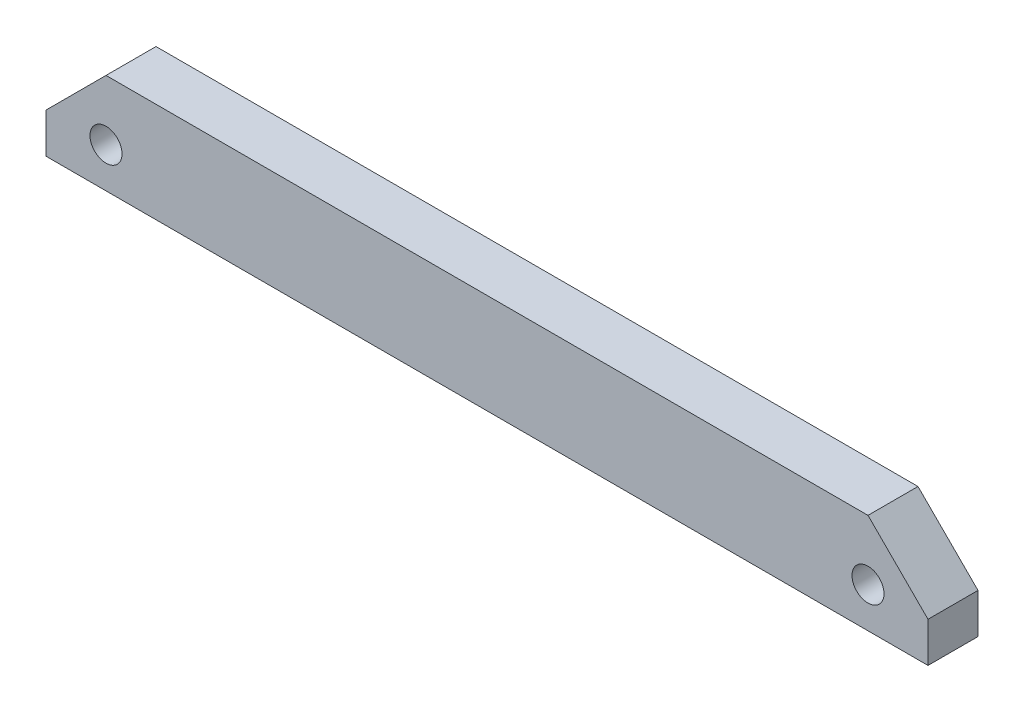
ISO-10303-21;
HEADER;
FILE_DESCRIPTION(('STEP AP214'),'2;1');
FILE_NAME('part.step','',(''),(''),'','','');
FILE_SCHEMA(('AUTOMOTIVE_DESIGN { 1 0 10303 214 1 1 1 1 }'));
ENDSEC;
DATA;
#1=APPLICATION_CONTEXT('core data for automotive mechanical design processes');
#2=APPLICATION_PROTOCOL_DEFINITION('international standard','automotive_design',2000,#1);
#3=PRODUCT_CONTEXT('',#1,'mechanical');
#4=PRODUCT('Part','Part','',(#3));
#5=PRODUCT_RELATED_PRODUCT_CATEGORY('part','',(#4));
#6=PRODUCT_DEFINITION_FORMATION('','',#4);
#7=PRODUCT_DEFINITION_CONTEXT('part definition',#1,'design');
#8=PRODUCT_DEFINITION('design','',#6,#7);
#9=PRODUCT_DEFINITION_SHAPE('','',#8);
#10=(LENGTH_UNIT() NAMED_UNIT(*) SI_UNIT(.MILLI.,.METRE.));
#11=(NAMED_UNIT(*) PLANE_ANGLE_UNIT() SI_UNIT($,.RADIAN.));
#12=(NAMED_UNIT(*) SI_UNIT($,.STERADIAN.) SOLID_ANGLE_UNIT());
#13=UNCERTAINTY_MEASURE_WITH_UNIT(LENGTH_MEASURE(1.E-05),#10,'distance_accuracy_value','');
#14=(GEOMETRIC_REPRESENTATION_CONTEXT(3) GLOBAL_UNCERTAINTY_ASSIGNED_CONTEXT((#13)) GLOBAL_UNIT_ASSIGNED_CONTEXT((#10,
#11,#12)) REPRESENTATION_CONTEXT('',''));
#15=CARTESIAN_POINT('',(0.,0.,0.));
#16=DIRECTION('',(0.,0.,1.));
#17=DIRECTION('',(1.,0.,0.));
#18=AXIS2_PLACEMENT_3D('',#15,#16,#17);
#19=CARTESIAN_POINT('',(44.1,0.,5.));
#20=DIRECTION('',(-1.,0.,0.));
#21=DIRECTION('',(0.,0.,1.));
#22=AXIS2_PLACEMENT_3D('',#19,#20,#21);
#23=PLANE('',#22);
#24=DIRECTION('',(0.,1.,0.));
#25=VECTOR('',#24,1.);
#26=CARTESIAN_POINT('',(44.1,0.,0.));
#27=LINE('',#26,#25);
#28=CARTESIAN_POINT('',(44.1,0.,0.));
#29=VERTEX_POINT('',#28);
#30=CARTESIAN_POINT('',(44.1,4.00000000000002,0.));
#31=VERTEX_POINT('',#30);
#32=EDGE_CURVE('E128',#29,#31,#27,.T.);
#33=ORIENTED_EDGE('',*,*,#32,.T.);
#34=DIRECTION('',(0.,0.,-1.));
#35=VECTOR('',#34,1.);
#36=CARTESIAN_POINT('',(44.1,4.00000000000002,5.));
#37=LINE('',#36,#35);
#38=CARTESIAN_POINT('',(44.1,4.00000000000002,5.));
#39=VERTEX_POINT('',#38);
#40=EDGE_CURVE('E11',#39,#31,#37,.T.);
#41=ORIENTED_EDGE('',*,*,#40,.F.);
#42=DIRECTION('',(0.,1.,0.));
#43=VECTOR('',#42,1.);
#44=CARTESIAN_POINT('',(44.1,0.,5.));
#45=LINE('',#44,#43);
#46=CARTESIAN_POINT('',(44.1,0.,5.));
#47=VERTEX_POINT('',#46);
#48=EDGE_CURVE('E145',#47,#39,#45,.T.);
#49=ORIENTED_EDGE('',*,*,#48,.F.);
#50=DIRECTION('',(0.,0.,-1.));
#51=VECTOR('',#50,1.);
#52=CARTESIAN_POINT('',(44.1,0.,5.));
#53=LINE('',#52,#51);
#54=EDGE_CURVE('E124',#47,#29,#53,.T.);
#55=ORIENTED_EDGE('',*,*,#54,.T.);
#56=EDGE_LOOP('',(#33,#41,#49,#55));
#57=FACE_BOUND('',#56,.T.);
#58=ADVANCED_FACE('F39',(#57),#23,.F.);
#59=CARTESIAN_POINT('',(44.1,4.00000000000002,5.));
#60=DIRECTION('',(-0.707106781186544,-0.707106781186551,0.));
#61=DIRECTION('',(0.707106781186551,-0.707106781186544,0.));
#62=AXIS2_PLACEMENT_3D('',#59,#60,#61);
#63=PLANE('',#62);
#64=DIRECTION('',(-0.707106781186551,0.707106781186544,0.));
#65=VECTOR('',#64,1.);
#66=CARTESIAN_POINT('',(44.1,4.00000000000002,0.));
#67=LINE('',#66,#65);
#68=CARTESIAN_POINT('',(38.1,10.,0.));
#69=VERTEX_POINT('',#68);
#70=EDGE_CURVE('E132',#31,#69,#67,.T.);
#71=ORIENTED_EDGE('',*,*,#70,.T.);
#72=DIRECTION('',(0.,0.,-1.));
#73=VECTOR('',#72,1.);
#74=CARTESIAN_POINT('',(38.1,10.,5.));
#75=LINE('',#74,#73);
#76=CARTESIAN_POINT('',(38.1,10.,5.));
#77=VERTEX_POINT('',#76);
#78=EDGE_CURVE('E48',#77,#69,#75,.T.);
#79=ORIENTED_EDGE('',*,*,#78,.F.);
#80=DIRECTION('',(-0.707106781186551,0.707106781186544,0.));
#81=VECTOR('',#80,1.);
#82=CARTESIAN_POINT('',(44.1,4.00000000000002,5.));
#83=LINE('',#82,#81);
#84=EDGE_CURVE('E93',#39,#77,#83,.T.);
#85=ORIENTED_EDGE('',*,*,#84,.F.);
#86=ORIENTED_EDGE('',*,*,#40,.T.);
#87=EDGE_LOOP('',(#71,#79,#85,#86));
#88=FACE_BOUND('',#87,.T.);
#89=ADVANCED_FACE('F174',(#88),#63,.F.);
#90=CARTESIAN_POINT('',(38.1,10.,5.));
#91=DIRECTION('',(0.,-1.,0.));
#92=DIRECTION('',(1.,0.,0.));
#93=AXIS2_PLACEMENT_3D('',#90,#91,#92);
#94=PLANE('',#93);
#95=DIRECTION('',(-1.,0.,0.));
#96=VECTOR('',#95,1.);
#97=CARTESIAN_POINT('',(38.1,10.,0.));
#98=LINE('',#97,#96);
#99=CARTESIAN_POINT('',(-38.1000000000001,9.99999999999999,0.));
#100=VERTEX_POINT('',#99);
#101=EDGE_CURVE('E136',#69,#100,#98,.T.);
#102=ORIENTED_EDGE('',*,*,#101,.T.);
#103=DIRECTION('',(0.,0.,-1.));
#104=VECTOR('',#103,1.);
#105=CARTESIAN_POINT('',(-38.1000000000001,9.99999999999999,5.));
#106=LINE('',#105,#104);
#107=CARTESIAN_POINT('',(-38.1000000000001,9.99999999999999,5.));
#108=VERTEX_POINT('',#107);
#109=EDGE_CURVE('E117',#108,#100,#106,.T.);
#110=ORIENTED_EDGE('',*,*,#109,.F.);
#111=DIRECTION('',(-1.,0.,0.));
#112=VECTOR('',#111,1.);
#113=CARTESIAN_POINT('',(38.1,10.,5.));
#114=LINE('',#113,#112);
#115=EDGE_CURVE('E106',#77,#108,#114,.T.);
#116=ORIENTED_EDGE('',*,*,#115,.F.);
#117=ORIENTED_EDGE('',*,*,#78,.T.);
#118=EDGE_LOOP('',(#102,#110,#116,#117));
#119=FACE_BOUND('',#118,.T.);
#120=ADVANCED_FACE('F155',(#119),#94,.F.);
#121=CARTESIAN_POINT('',(-44.1,4.,5.));
#122=DIRECTION('',(0.707106781186552,-0.707106781186543,0.));
#123=DIRECTION('',(0.707106781186543,0.707106781186552,0.));
#124=AXIS2_PLACEMENT_3D('',#121,#122,#123);
#125=PLANE('',#124);
#126=DIRECTION('',(-0.707106781186543,-0.707106781186552,0.));
#127=VECTOR('',#126,1.);
#128=CARTESIAN_POINT('',(-44.1,4.,0.));
#129=LINE('',#128,#127);
#130=CARTESIAN_POINT('',(-44.1,4.,0.));
#131=VERTEX_POINT('',#130);
#132=EDGE_CURVE('E115',#100,#131,#129,.T.);
#133=ORIENTED_EDGE('',*,*,#132,.T.);
#134=DIRECTION('',(0.,0.,-1.));
#135=VECTOR('',#134,1.);
#136=CARTESIAN_POINT('',(-44.1,4.,5.));
#137=LINE('',#136,#135);
#138=CARTESIAN_POINT('',(-44.1,4.,5.));
#139=VERTEX_POINT('',#138);
#140=EDGE_CURVE('E112',#139,#131,#137,.T.);
#141=ORIENTED_EDGE('',*,*,#140,.F.);
#142=DIRECTION('',(-0.707106781186543,-0.707106781186552,0.));
#143=VECTOR('',#142,1.);
#144=CARTESIAN_POINT('',(-44.1,4.,5.));
#145=LINE('',#144,#143);
#146=EDGE_CURVE('E100',#108,#139,#145,.T.);
#147=ORIENTED_EDGE('',*,*,#146,.F.);
#148=ORIENTED_EDGE('',*,*,#109,.T.);
#149=EDGE_LOOP('',(#133,#141,#147,#148));
#150=FACE_BOUND('',#149,.T.);
#151=ADVANCED_FACE('F113',(#150),#125,.F.);
#152=CARTESIAN_POINT('',(-44.1,0.,5.));
#153=DIRECTION('',(1.,0.,0.));
#154=DIRECTION('',(0.,0.,-1.));
#155=AXIS2_PLACEMENT_3D('',#152,#153,#154);
#156=PLANE('',#155);
#157=DIRECTION('',(0.,-1.,0.));
#158=VECTOR('',#157,1.);
#159=CARTESIAN_POINT('',(-44.1,0.,0.));
#160=LINE('',#159,#158);
#161=CARTESIAN_POINT('',(-44.1,0.,0.));
#162=VERTEX_POINT('',#161);
#163=EDGE_CURVE('E79',#131,#162,#160,.T.);
#164=ORIENTED_EDGE('',*,*,#163,.T.);
#165=DIRECTION('',(0.,0.,-1.));
#166=VECTOR('',#165,1.);
#167=CARTESIAN_POINT('',(-44.1,0.,5.));
#168=LINE('',#167,#166);
#169=CARTESIAN_POINT('',(-44.1,0.,5.));
#170=VERTEX_POINT('',#169);
#171=EDGE_CURVE('E118',#170,#162,#168,.T.);
#172=ORIENTED_EDGE('',*,*,#171,.F.);
#173=DIRECTION('',(0.,-1.,0.));
#174=VECTOR('',#173,1.);
#175=CARTESIAN_POINT('',(-44.1,0.,5.));
#176=LINE('',#175,#174);
#177=EDGE_CURVE('E104',#139,#170,#176,.T.);
#178=ORIENTED_EDGE('',*,*,#177,.F.);
#179=ORIENTED_EDGE('',*,*,#140,.T.);
#180=EDGE_LOOP('',(#164,#172,#178,#179));
#181=FACE_BOUND('',#180,.T.);
#182=ADVANCED_FACE('F120',(#181),#156,.F.);
#183=CARTESIAN_POINT('',(-44.1,0.,5.));
#184=DIRECTION('',(0.,1.,0.));
#185=DIRECTION('',(-1.,0.,0.));
#186=AXIS2_PLACEMENT_3D('',#183,#184,#185);
#187=PLANE('',#186);
#188=DIRECTION('',(1.,0.,0.));
#189=VECTOR('',#188,1.);
#190=CARTESIAN_POINT('',(-44.1,0.,0.));
#191=LINE('',#190,#189);
#192=EDGE_CURVE('E85',#162,#29,#191,.T.);
#193=ORIENTED_EDGE('',*,*,#192,.T.);
#194=ORIENTED_EDGE('',*,*,#54,.F.);
#195=DIRECTION('',(1.,0.,0.));
#196=VECTOR('',#195,1.);
#197=CARTESIAN_POINT('',(-44.1,0.,5.));
#198=LINE('',#197,#196);
#199=EDGE_CURVE('E56',#170,#47,#198,.T.);
#200=ORIENTED_EDGE('',*,*,#199,.F.);
#201=ORIENTED_EDGE('',*,*,#171,.T.);
#202=EDGE_LOOP('',(#193,#194,#200,#201));
#203=FACE_BOUND('',#202,.T.);
#204=ADVANCED_FACE('F162',(#203),#187,.F.);
#205=CARTESIAN_POINT('',(0.,0.,5.));
#206=DIRECTION('',(0.,0.,1.));
#207=DIRECTION('',(1.,0.,0.));
#208=AXIS2_PLACEMENT_3D('',#205,#206,#207);
#209=PLANE('',#208);
#210=CARTESIAN_POINT('',(-38.1,4.,5.));
#211=DIRECTION('',(0.,0.,1.));
#212=DIRECTION('',(1.,0.,0.));
#213=AXIS2_PLACEMENT_3D('',#210,#211,#212);
#214=CIRCLE('',#213,1.60000000000001);
#215=CARTESIAN_POINT('',(-36.5,4.,5.));
#216=VERTEX_POINT('',#215);
#217=EDGE_CURVE('E239',#216,#216,#214,.T.);
#218=ORIENTED_EDGE('',*,*,#217,.F.);
#219=EDGE_LOOP('',(#218));
#220=FACE_BOUND('',#219,.T.);
#221=CARTESIAN_POINT('',(38.1,4.,5.));
#222=DIRECTION('',(0.,0.,1.));
#223=DIRECTION('',(-1.,0.,0.));
#224=AXIS2_PLACEMENT_3D('',#221,#222,#223);
#225=CIRCLE('',#224,1.60000000000001);
#226=CARTESIAN_POINT('',(36.5,4.,5.));
#227=VERTEX_POINT('',#226);
#228=EDGE_CURVE('E247',#227,#227,#225,.T.);
#229=ORIENTED_EDGE('',*,*,#228,.F.);
#230=EDGE_LOOP('',(#229));
#231=FACE_BOUND('',#230,.T.);
#232=ORIENTED_EDGE('',*,*,#48,.T.);
#233=ORIENTED_EDGE('',*,*,#84,.T.);
#234=ORIENTED_EDGE('',*,*,#115,.T.);
#235=ORIENTED_EDGE('',*,*,#146,.T.);
#236=ORIENTED_EDGE('',*,*,#177,.T.);
#237=ORIENTED_EDGE('',*,*,#199,.T.);
#238=EDGE_LOOP('',(#232,#233,#234,#235,#236,#237));
#239=FACE_BOUND('',#238,.T.);
#240=ADVANCED_FACE('F102',(#220,#231,#239),#209,.T.);
#241=CARTESIAN_POINT('',(0.,0.,0.));
#242=DIRECTION('',(0.,0.,1.));
#243=DIRECTION('',(1.,0.,0.));
#244=AXIS2_PLACEMENT_3D('',#241,#242,#243);
#245=PLANE('',#244);
#246=CARTESIAN_POINT('',(-38.1,4.,0.));
#247=DIRECTION('',(0.,0.,1.));
#248=DIRECTION('',(1.,0.,0.));
#249=AXIS2_PLACEMENT_3D('',#246,#247,#248);
#250=CIRCLE('',#249,1.60000000000001);
#251=CARTESIAN_POINT('',(-36.5,4.,0.));
#252=VERTEX_POINT('',#251);
#253=EDGE_CURVE('E133',#252,#252,#250,.T.);
#254=ORIENTED_EDGE('',*,*,#253,.T.);
#255=EDGE_LOOP('',(#254));
#256=FACE_BOUND('',#255,.T.);
#257=CARTESIAN_POINT('',(38.1,4.,0.));
#258=DIRECTION('',(0.,0.,1.));
#259=DIRECTION('',(-1.,0.,0.));
#260=AXIS2_PLACEMENT_3D('',#257,#258,#259);
#261=CIRCLE('',#260,1.60000000000001);
#262=CARTESIAN_POINT('',(36.5,4.,0.));
#263=VERTEX_POINT('',#262);
#264=EDGE_CURVE('E241',#263,#263,#261,.T.);
#265=ORIENTED_EDGE('',*,*,#264,.T.);
#266=EDGE_LOOP('',(#265));
#267=FACE_BOUND('',#266,.T.);
#268=ORIENTED_EDGE('',*,*,#32,.F.);
#269=ORIENTED_EDGE('',*,*,#192,.F.);
#270=ORIENTED_EDGE('',*,*,#163,.F.);
#271=ORIENTED_EDGE('',*,*,#132,.F.);
#272=ORIENTED_EDGE('',*,*,#101,.F.);
#273=ORIENTED_EDGE('',*,*,#70,.F.);
#274=EDGE_LOOP('',(#268,#269,#270,#271,#272,#273));
#275=FACE_BOUND('',#274,.T.);
#276=ADVANCED_FACE('F158',(#256,#267,#275),#245,.F.);
#277=CARTESIAN_POINT('',(38.1,4.,0.));
#278=DIRECTION('',(0.,0.,1.));
#279=DIRECTION('',(1.,0.,0.));
#280=AXIS2_PLACEMENT_3D('',#277,#278,#279);
#281=CYLINDRICAL_SURFACE('',#280,1.60000000000001);
#282=ORIENTED_EDGE('',*,*,#264,.F.);
#283=EDGE_LOOP('',(#282));
#284=FACE_BOUND('',#283,.T.);
#285=ORIENTED_EDGE('',*,*,#228,.T.);
#286=EDGE_LOOP('',(#285));
#287=FACE_BOUND('',#286,.T.);
#288=ADVANCED_FACE('F211',(#284,#287),#281,.F.);
#289=CARTESIAN_POINT('',(-38.1,4.,0.));
#290=DIRECTION('',(0.,0.,1.));
#291=DIRECTION('',(1.,0.,0.));
#292=AXIS2_PLACEMENT_3D('',#289,#290,#291);
#293=CYLINDRICAL_SURFACE('',#292,1.60000000000001);
#294=ORIENTED_EDGE('',*,*,#253,.F.);
#295=EDGE_LOOP('',(#294));
#296=FACE_BOUND('',#295,.T.);
#297=ORIENTED_EDGE('',*,*,#217,.T.);
#298=EDGE_LOOP('',(#297));
#299=FACE_BOUND('',#298,.T.);
#300=ADVANCED_FACE('F220',(#296,#299),#293,.F.);
#301=CLOSED_SHELL('',(#58,#89,#120,#151,#182,#204,#240,#276,#288,#300));
#302=MANIFOLD_SOLID_BREP('B2',#301);
#303=ADVANCED_BREP_SHAPE_REPRESENTATION('',(#18,#302),#14);
#304=SHAPE_DEFINITION_REPRESENTATION(#9,#303);
ENDSEC;
END-ISO-10303-21;
